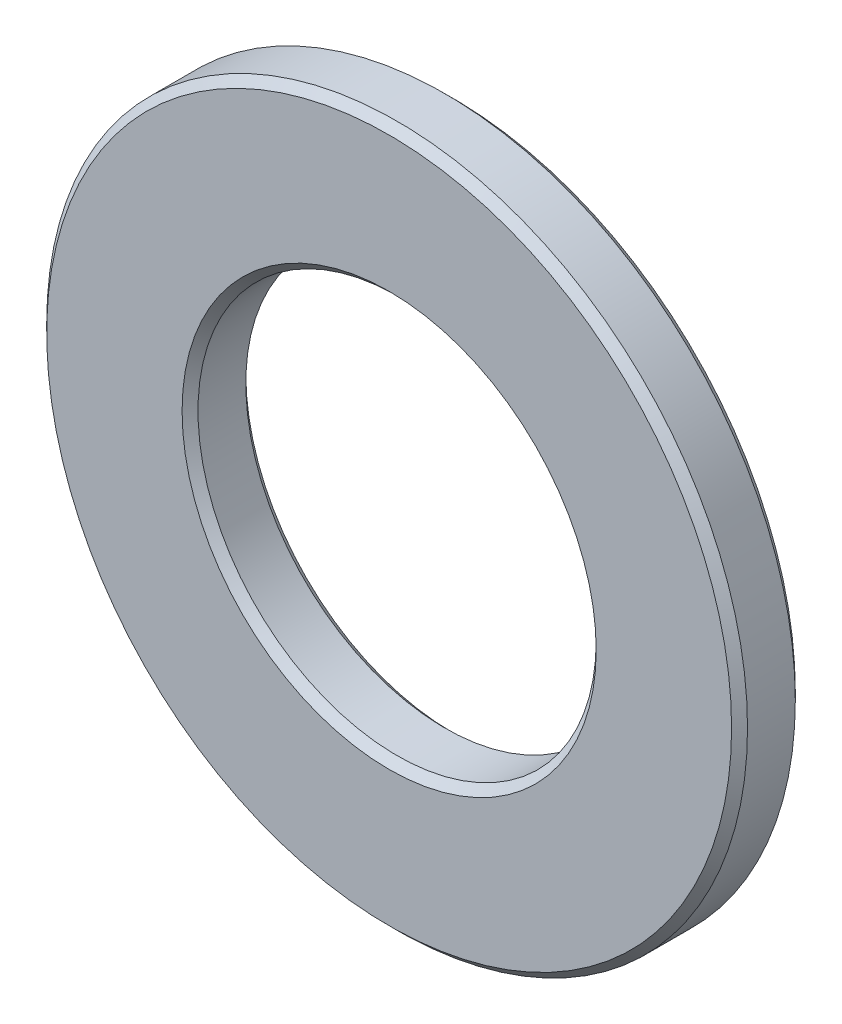
ISO-10303-21;
HEADER;
FILE_DESCRIPTION(('STEP AP214'),'2;1');
FILE_NAME('part.step','',(''),(''),'','','');
FILE_SCHEMA(('AUTOMOTIVE_DESIGN { 1 0 10303 214 1 1 1 1 }'));
ENDSEC;
DATA;
#1=APPLICATION_CONTEXT('core data for automotive mechanical design processes');
#2=APPLICATION_PROTOCOL_DEFINITION('international standard','automotive_design',2000,#1);
#3=PRODUCT_CONTEXT('',#1,'mechanical');
#4=PRODUCT('Part','Part','',(#3));
#5=PRODUCT_RELATED_PRODUCT_CATEGORY('part','',(#4));
#6=PRODUCT_DEFINITION_FORMATION('','',#4);
#7=PRODUCT_DEFINITION_CONTEXT('part definition',#1,'design');
#8=PRODUCT_DEFINITION('design','',#6,#7);
#9=PRODUCT_DEFINITION_SHAPE('','',#8);
#10=(LENGTH_UNIT() NAMED_UNIT(*) SI_UNIT(.MILLI.,.METRE.));
#11=(NAMED_UNIT(*) PLANE_ANGLE_UNIT() SI_UNIT($,.RADIAN.));
#12=(NAMED_UNIT(*) SI_UNIT($,.STERADIAN.) SOLID_ANGLE_UNIT());
#13=UNCERTAINTY_MEASURE_WITH_UNIT(LENGTH_MEASURE(1.E-05),#10,'distance_accuracy_value','');
#14=(GEOMETRIC_REPRESENTATION_CONTEXT(3) GLOBAL_UNCERTAINTY_ASSIGNED_CONTEXT((#13)) GLOBAL_UNIT_ASSIGNED_CONTEXT((#10,
#11,#12)) REPRESENTATION_CONTEXT('',''));
#15=CARTESIAN_POINT('',(0.,0.,0.));
#16=DIRECTION('',(0.,0.,1.));
#17=DIRECTION('',(1.,0.,0.));
#18=AXIS2_PLACEMENT_3D('',#15,#16,#17);
#19=CARTESIAN_POINT('',(0.,0.,4.));
#20=DIRECTION('',(0.,0.,1.));
#21=DIRECTION('',(1.,0.,0.));
#22=AXIS2_PLACEMENT_3D('',#19,#20,#21);
#23=PLANE('',#22);
#24=CARTESIAN_POINT('',(0.,0.,4.));
#25=DIRECTION('',(0.,0.,1.));
#26=DIRECTION('',(1.,0.,0.));
#27=AXIS2_PLACEMENT_3D('',#24,#25,#26);
#28=CIRCLE('',#27,13.);
#29=CARTESIAN_POINT('',(13.,0.,4.));
#30=VERTEX_POINT('',#29);
#31=EDGE_CURVE('E10',#30,#30,#28,.F.);
#32=ORIENTED_EDGE('',*,*,#31,.T.);
#33=EDGE_LOOP('',(#32));
#34=FACE_BOUND('',#33,.T.);
#35=CARTESIAN_POINT('',(0.,0.,4.));
#36=DIRECTION('',(0.,0.,1.));
#37=DIRECTION('',(1.,0.,0.));
#38=AXIS2_PLACEMENT_3D('',#35,#36,#37);
#39=CIRCLE('',#38,21.5);
#40=CARTESIAN_POINT('',(21.5,0.,4.));
#41=VERTEX_POINT('',#40);
#42=EDGE_CURVE('E37',#41,#41,#39,.T.);
#43=ORIENTED_EDGE('',*,*,#42,.T.);
#44=EDGE_LOOP('',(#43));
#45=FACE_BOUND('',#44,.T.);
#46=ADVANCED_FACE('F30',(#34,#45),#23,.T.);
#47=CARTESIAN_POINT('',(0.,0.,0.));
#48=DIRECTION('',(0.,0.,1.));
#49=DIRECTION('',(1.,0.,0.));
#50=AXIS2_PLACEMENT_3D('',#47,#48,#49);
#51=PLANE('',#50);
#52=CARTESIAN_POINT('',(0.,0.,0.));
#53=DIRECTION('',(0.,0.,1.));
#54=DIRECTION('',(1.,0.,0.));
#55=AXIS2_PLACEMENT_3D('',#52,#53,#54);
#56=CIRCLE('',#55,13.);
#57=CARTESIAN_POINT('',(13.,0.,0.));
#58=VERTEX_POINT('',#57);
#59=EDGE_CURVE('E56',#58,#58,#56,.T.);
#60=ORIENTED_EDGE('',*,*,#59,.T.);
#61=EDGE_LOOP('',(#60));
#62=FACE_BOUND('',#61,.T.);
#63=CARTESIAN_POINT('',(0.,0.,0.));
#64=DIRECTION('',(0.,0.,1.));
#65=DIRECTION('',(1.,0.,0.));
#66=AXIS2_PLACEMENT_3D('',#63,#64,#65);
#67=CIRCLE('',#66,21.5);
#68=CARTESIAN_POINT('',(21.5,0.,0.));
#69=VERTEX_POINT('',#68);
#70=EDGE_CURVE('E59',#69,#69,#67,.F.);
#71=ORIENTED_EDGE('',*,*,#70,.T.);
#72=EDGE_LOOP('',(#71));
#73=FACE_BOUND('',#72,.T.);
#74=ADVANCED_FACE('F63',(#62,#73),#51,.F.);
#75=CARTESIAN_POINT('',(0.,0.,4.));
#76=DIRECTION('',(0.,0.,-1.));
#77=DIRECTION('',(-1.,0.,0.));
#78=AXIS2_PLACEMENT_3D('',#75,#76,#77);
#79=CYLINDRICAL_SURFACE('',#78,22.);
#80=CARTESIAN_POINT('',(0.,0.,0.5));
#81=DIRECTION('',(0.,0.,1.));
#82=DIRECTION('',(1.,0.,0.));
#83=AXIS2_PLACEMENT_3D('',#80,#81,#82);
#84=CIRCLE('',#83,22.);
#85=CARTESIAN_POINT('',(22.,0.,0.5));
#86=VERTEX_POINT('',#85);
#87=EDGE_CURVE('E41',#86,#86,#84,.T.);
#88=ORIENTED_EDGE('',*,*,#87,.T.);
#89=EDGE_LOOP('',(#88));
#90=FACE_BOUND('',#89,.T.);
#91=CARTESIAN_POINT('',(0.,0.,3.50000000000002));
#92=DIRECTION('',(0.,0.,1.));
#93=DIRECTION('',(1.,0.,0.));
#94=AXIS2_PLACEMENT_3D('',#91,#92,#93);
#95=CIRCLE('',#94,22.);
#96=CARTESIAN_POINT('',(22.,0.,3.50000000000002));
#97=VERTEX_POINT('',#96);
#98=EDGE_CURVE('E45',#97,#97,#95,.F.);
#99=ORIENTED_EDGE('',*,*,#98,.T.);
#100=EDGE_LOOP('',(#99));
#101=FACE_BOUND('',#100,.T.);
#102=ADVANCED_FACE('F73',(#90,#101),#79,.T.);
#103=CARTESIAN_POINT('',(0.,0.,4.));
#104=DIRECTION('',(0.,0.,-1.));
#105=DIRECTION('',(-1.,0.,0.));
#106=AXIS2_PLACEMENT_3D('',#103,#104,#105);
#107=CYLINDRICAL_SURFACE('',#106,12.5);
#108=CARTESIAN_POINT('',(0.,0.,0.499999999999997));
#109=DIRECTION('',(0.,0.,1.));
#110=DIRECTION('',(1.,0.,0.));
#111=AXIS2_PLACEMENT_3D('',#108,#109,#110);
#112=CIRCLE('',#111,12.5);
#113=CARTESIAN_POINT('',(12.5,0.,0.499999999999997));
#114=VERTEX_POINT('',#113);
#115=EDGE_CURVE('E50',#114,#114,#112,.F.);
#116=ORIENTED_EDGE('',*,*,#115,.T.);
#117=EDGE_LOOP('',(#116));
#118=FACE_BOUND('',#117,.T.);
#119=CARTESIAN_POINT('',(0.,0.,3.5));
#120=DIRECTION('',(0.,0.,1.));
#121=DIRECTION('',(1.,0.,0.));
#122=AXIS2_PLACEMENT_3D('',#119,#120,#121);
#123=CIRCLE('',#122,12.5);
#124=CARTESIAN_POINT('',(12.5,0.,3.5));
#125=VERTEX_POINT('',#124);
#126=EDGE_CURVE('E53',#125,#125,#123,.T.);
#127=ORIENTED_EDGE('',*,*,#126,.T.);
#128=EDGE_LOOP('',(#127));
#129=FACE_BOUND('',#128,.T.);
#130=ADVANCED_FACE('F76',(#118,#129),#107,.F.);
#131=CARTESIAN_POINT('',(0.,0.,0.));
#132=DIRECTION('',(0.,0.,-1.));
#133=DIRECTION('',(-1.,0.,0.));
#134=AXIS2_PLACEMENT_3D('',#131,#132,#133);
#135=CONICAL_SURFACE('',#134,13.,0.785398163397448);
#136=ORIENTED_EDGE('',*,*,#115,.F.);
#137=EDGE_LOOP('',(#136));
#138=FACE_BOUND('',#137,.T.);
#139=ORIENTED_EDGE('',*,*,#59,.F.);
#140=EDGE_LOOP('',(#139));
#141=FACE_BOUND('',#140,.T.);
#142=ADVANCED_FACE('F69',(#138,#141),#135,.F.);
#143=CARTESIAN_POINT('',(0.,0.,0.5));
#144=DIRECTION('',(0.,0.,1.));
#145=DIRECTION('',(1.,0.,0.));
#146=AXIS2_PLACEMENT_3D('',#143,#144,#145);
#147=CONICAL_SURFACE('',#146,22.,0.785398163397448);
#148=ORIENTED_EDGE('',*,*,#70,.F.);
#149=EDGE_LOOP('',(#148));
#150=FACE_BOUND('',#149,.T.);
#151=ORIENTED_EDGE('',*,*,#87,.F.);
#152=EDGE_LOOP('',(#151));
#153=FACE_BOUND('',#152,.T.);
#154=ADVANCED_FACE('F65',(#150,#153),#147,.T.);
#155=CARTESIAN_POINT('',(0.,0.,3.5));
#156=DIRECTION('',(0.,0.,1.));
#157=DIRECTION('',(1.,0.,0.));
#158=AXIS2_PLACEMENT_3D('',#155,#156,#157);
#159=CONICAL_SURFACE('',#158,12.5,0.785398163397455);
#160=ORIENTED_EDGE('',*,*,#31,.F.);
#161=EDGE_LOOP('',(#160));
#162=FACE_BOUND('',#161,.T.);
#163=ORIENTED_EDGE('',*,*,#126,.F.);
#164=EDGE_LOOP('',(#163));
#165=FACE_BOUND('',#164,.T.);
#166=ADVANCED_FACE('F68',(#162,#165),#159,.F.);
#167=CARTESIAN_POINT('',(0.,0.,4.));
#168=DIRECTION('',(0.,0.,-1.));
#169=DIRECTION('',(-1.,0.,0.));
#170=AXIS2_PLACEMENT_3D('',#167,#168,#169);
#171=CONICAL_SURFACE('',#170,21.5,0.785398163397452);
#172=ORIENTED_EDGE('',*,*,#98,.F.);
#173=EDGE_LOOP('',(#172));
#174=FACE_BOUND('',#173,.T.);
#175=ORIENTED_EDGE('',*,*,#42,.F.);
#176=EDGE_LOOP('',(#175));
#177=FACE_BOUND('',#176,.T.);
#178=ADVANCED_FACE('F32',(#174,#177),#171,.T.);
#179=CLOSED_SHELL('',(#46,#74,#102,#130,#142,#154,#166,#178));
#180=MANIFOLD_SOLID_BREP('B2',#179);
#181=ADVANCED_BREP_SHAPE_REPRESENTATION('',(#18,#180),#14);
#182=SHAPE_DEFINITION_REPRESENTATION(#9,#181);
ENDSEC;
END-ISO-10303-21;
